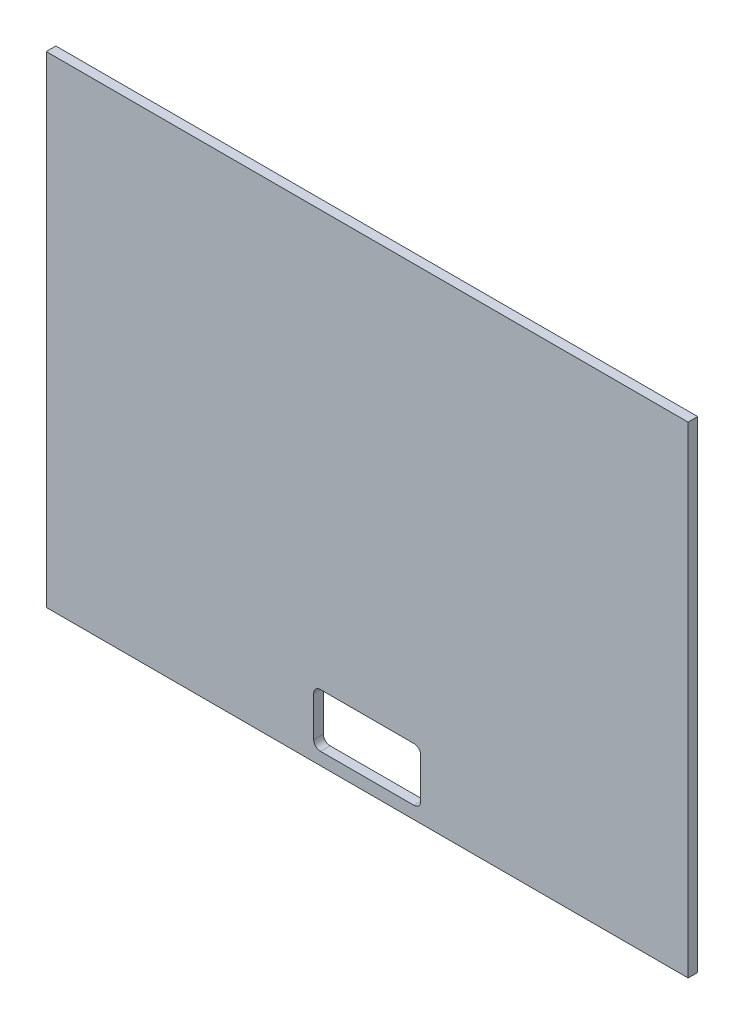
ISO-10303-21;
HEADER;
FILE_DESCRIPTION(('STEP AP214'),'2;1');
FILE_NAME('part.step','',(''),(''),'','','');
FILE_SCHEMA(('AUTOMOTIVE_DESIGN { 1 0 10303 214 1 1 1 1 }'));
ENDSEC;
DATA;
#1=APPLICATION_CONTEXT('core data for automotive mechanical design processes');
#2=APPLICATION_PROTOCOL_DEFINITION('international standard','automotive_design',2000,#1);
#3=PRODUCT_CONTEXT('',#1,'mechanical');
#4=PRODUCT('Part','Part','',(#3));
#5=PRODUCT_RELATED_PRODUCT_CATEGORY('part','',(#4));
#6=PRODUCT_DEFINITION_FORMATION('','',#4);
#7=PRODUCT_DEFINITION_CONTEXT('part definition',#1,'design');
#8=PRODUCT_DEFINITION('design','',#6,#7);
#9=PRODUCT_DEFINITION_SHAPE('','',#8);
#10=(LENGTH_UNIT() NAMED_UNIT(*) SI_UNIT(.MILLI.,.METRE.));
#11=(NAMED_UNIT(*) PLANE_ANGLE_UNIT() SI_UNIT($,.RADIAN.));
#12=(NAMED_UNIT(*) SI_UNIT($,.STERADIAN.) SOLID_ANGLE_UNIT());
#13=UNCERTAINTY_MEASURE_WITH_UNIT(LENGTH_MEASURE(1.E-05),#10,'distance_accuracy_value','');
#14=(GEOMETRIC_REPRESENTATION_CONTEXT(3) GLOBAL_UNCERTAINTY_ASSIGNED_CONTEXT((#13)) GLOBAL_UNIT_ASSIGNED_CONTEXT((#10,
#11,#12)) REPRESENTATION_CONTEXT('',''));
#15=CARTESIAN_POINT('',(0.,0.,0.));
#16=DIRECTION('',(0.,0.,1.));
#17=DIRECTION('',(1.,0.,0.));
#18=AXIS2_PLACEMENT_3D('',#15,#16,#17);
#19=CARTESIAN_POINT('',(812.8,-457.2,18.25625));
#20=DIRECTION('',(-1.,0.,0.));
#21=DIRECTION('',(0.,0.,1.));
#22=AXIS2_PLACEMENT_3D('',#19,#20,#21);
#23=PLANE('',#22);
#24=DIRECTION('',(0.,1.,0.));
#25=VECTOR('',#24,1.);
#26=CARTESIAN_POINT('',(812.8,-457.2,0.));
#27=LINE('',#26,#25);
#28=CARTESIAN_POINT('',(812.8,-457.2,0.));
#29=VERTEX_POINT('',#28);
#30=CARTESIAN_POINT('',(812.8,457.2,0.));
#31=VERTEX_POINT('',#30);
#32=EDGE_CURVE('E161',#29,#31,#27,.T.);
#33=ORIENTED_EDGE('',*,*,#32,.T.);
#34=DIRECTION('',(0.,0.,-1.));
#35=VECTOR('',#34,1.);
#36=CARTESIAN_POINT('',(812.8,457.2,18.25625));
#37=LINE('',#36,#35);
#38=CARTESIAN_POINT('',(812.8,457.2,18.25625));
#39=VERTEX_POINT('',#38);
#40=EDGE_CURVE('E140',#39,#31,#37,.T.);
#41=ORIENTED_EDGE('',*,*,#40,.F.);
#42=DIRECTION('',(0.,1.,0.));
#43=VECTOR('',#42,1.);
#44=CARTESIAN_POINT('',(812.8,-457.2,18.25625));
#45=LINE('',#44,#43);
#46=CARTESIAN_POINT('',(812.8,-457.2,18.25625));
#47=VERTEX_POINT('',#46);
#48=EDGE_CURVE('E148',#47,#39,#45,.T.);
#49=ORIENTED_EDGE('',*,*,#48,.F.);
#50=DIRECTION('',(0.,0.,-1.));
#51=VECTOR('',#50,1.);
#52=CARTESIAN_POINT('',(812.8,-457.2,18.25625));
#53=LINE('',#52,#51);
#54=EDGE_CURVE('E264',#47,#29,#53,.T.);
#55=ORIENTED_EDGE('',*,*,#54,.T.);
#56=EDGE_LOOP('',(#33,#41,#49,#55));
#57=FACE_BOUND('',#56,.T.);
#58=ADVANCED_FACE('F46',(#57),#23,.F.);
#59=CARTESIAN_POINT('',(-406.4,457.2,18.25625));
#60=DIRECTION('',(0.,-1.,0.));
#61=DIRECTION('',(0.,0.,-1.));
#62=AXIS2_PLACEMENT_3D('',#59,#60,#61);
#63=PLANE('',#62);
#64=DIRECTION('',(-1.,0.,0.));
#65=VECTOR('',#64,1.);
#66=CARTESIAN_POINT('',(-406.4,457.2,0.));
#67=LINE('',#66,#65);
#68=CARTESIAN_POINT('',(-406.4,457.2,0.));
#69=VERTEX_POINT('',#68);
#70=EDGE_CURVE('E245',#31,#69,#67,.T.);
#71=ORIENTED_EDGE('',*,*,#70,.T.);
#72=DIRECTION('',(0.,0.,-1.));
#73=VECTOR('',#72,1.);
#74=CARTESIAN_POINT('',(-406.4,457.2,18.25625));
#75=LINE('',#74,#73);
#76=CARTESIAN_POINT('',(-406.4,457.2,18.25625));
#77=VERTEX_POINT('',#76);
#78=EDGE_CURVE('E143',#77,#69,#75,.T.);
#79=ORIENTED_EDGE('',*,*,#78,.F.);
#80=DIRECTION('',(-1.,0.,0.));
#81=VECTOR('',#80,1.);
#82=CARTESIAN_POINT('',(-406.4,457.2,18.25625));
#83=LINE('',#82,#81);
#84=EDGE_CURVE('E136',#39,#77,#83,.T.);
#85=ORIENTED_EDGE('',*,*,#84,.F.);
#86=ORIENTED_EDGE('',*,*,#40,.T.);
#87=EDGE_LOOP('',(#71,#79,#85,#86));
#88=FACE_BOUND('',#87,.T.);
#89=ADVANCED_FACE('F138',(#88),#63,.F.);
#90=CARTESIAN_POINT('',(-406.4,-457.2,18.25625));
#91=DIRECTION('',(1.,0.,0.));
#92=DIRECTION('',(0.,0.,-1.));
#93=AXIS2_PLACEMENT_3D('',#90,#91,#92);
#94=PLANE('',#93);
#95=DIRECTION('',(0.,-1.,0.));
#96=VECTOR('',#95,1.);
#97=CARTESIAN_POINT('',(-406.4,-457.2,0.));
#98=LINE('',#97,#96);
#99=CARTESIAN_POINT('',(-406.4,-457.2,0.));
#100=VERTEX_POINT('',#99);
#101=EDGE_CURVE('E268',#69,#100,#98,.T.);
#102=ORIENTED_EDGE('',*,*,#101,.T.);
#103=DIRECTION('',(0.,0.,-1.));
#104=VECTOR('',#103,1.);
#105=CARTESIAN_POINT('',(-406.4,-457.2,18.25625));
#106=LINE('',#105,#104);
#107=CARTESIAN_POINT('',(-406.4,-457.2,18.25625));
#108=VERTEX_POINT('',#107);
#109=EDGE_CURVE('E171',#108,#100,#106,.T.);
#110=ORIENTED_EDGE('',*,*,#109,.F.);
#111=DIRECTION('',(0.,-1.,0.));
#112=VECTOR('',#111,1.);
#113=CARTESIAN_POINT('',(-406.4,-457.2,18.25625));
#114=LINE('',#113,#112);
#115=EDGE_CURVE('E147',#77,#108,#114,.T.);
#116=ORIENTED_EDGE('',*,*,#115,.F.);
#117=ORIENTED_EDGE('',*,*,#78,.T.);
#118=EDGE_LOOP('',(#102,#110,#116,#117));
#119=FACE_BOUND('',#118,.T.);
#120=ADVANCED_FACE('F286',(#119),#94,.F.);
#121=CARTESIAN_POINT('',(-406.4,-457.2,18.25625));
#122=DIRECTION('',(0.,1.,0.));
#123=DIRECTION('',(0.,0.,1.));
#124=AXIS2_PLACEMENT_3D('',#121,#122,#123);
#125=PLANE('',#124);
#126=DIRECTION('',(1.,0.,0.));
#127=VECTOR('',#126,1.);
#128=CARTESIAN_POINT('',(-406.4,-457.2,0.));
#129=LINE('',#128,#127);
#130=EDGE_CURVE('E158',#100,#29,#129,.T.);
#131=ORIENTED_EDGE('',*,*,#130,.T.);
#132=ORIENTED_EDGE('',*,*,#54,.F.);
#133=DIRECTION('',(1.,0.,0.));
#134=VECTOR('',#133,1.);
#135=CARTESIAN_POINT('',(-406.4,-457.2,18.25625));
#136=LINE('',#135,#134);
#137=EDGE_CURVE('E153',#108,#47,#136,.T.);
#138=ORIENTED_EDGE('',*,*,#137,.F.);
#139=ORIENTED_EDGE('',*,*,#109,.T.);
#140=EDGE_LOOP('',(#131,#132,#138,#139));
#141=FACE_BOUND('',#140,.T.);
#142=ADVANCED_FACE('F281',(#141),#125,.F.);
#143=CARTESIAN_POINT('',(0.,0.,18.25625));
#144=DIRECTION('',(0.,0.,-1.));
#145=DIRECTION('',(-1.,0.,0.));
#146=AXIS2_PLACEMENT_3D('',#143,#144,#145);
#147=PLANE('',#146);
#148=DIRECTION('',(1.,0.,0.));
#149=VECTOR('',#148,1.);
#150=CARTESIAN_POINT('',(304.8,-433.499600817332,18.25625));
#151=LINE('',#150,#149);
#152=CARTESIAN_POINT('',(114.3,-433.499600817332,18.25625));
#153=VERTEX_POINT('',#152);
#154=CARTESIAN_POINT('',(292.1,-433.499600817332,18.25625));
#155=VERTEX_POINT('',#154);
#156=EDGE_CURVE('E233',#153,#155,#151,.T.);
#157=ORIENTED_EDGE('',*,*,#156,.F.);
#158=CARTESIAN_POINT('',(114.3,-420.799600817332,18.25625));
#159=DIRECTION('',(0.,0.,-1.));
#160=DIRECTION('',(-1.,0.,0.));
#161=AXIS2_PLACEMENT_3D('',#158,#159,#160);
#162=CIRCLE('',#161,12.7);
#163=CARTESIAN_POINT('',(101.6,-420.799600817332,18.25625));
#164=VERTEX_POINT('',#163);
#165=EDGE_CURVE('E204',#153,#164,#162,.T.);
#166=ORIENTED_EDGE('',*,*,#165,.T.);
#167=DIRECTION('',(0.,-1.,0.));
#168=VECTOR('',#167,1.);
#169=CARTESIAN_POINT('',(101.6,-433.499600817332,18.25625));
#170=LINE('',#169,#168);
#171=CARTESIAN_POINT('',(101.6,-344.599600817332,18.25625));
#172=VERTEX_POINT('',#171);
#173=EDGE_CURVE('E251',#172,#164,#170,.T.);
#174=ORIENTED_EDGE('',*,*,#173,.F.);
#175=CARTESIAN_POINT('',(114.3,-344.599600817332,18.25625));
#176=DIRECTION('',(0.,0.,-1.));
#177=DIRECTION('',(-1.,0.,0.));
#178=AXIS2_PLACEMENT_3D('',#175,#176,#177);
#179=CIRCLE('',#178,12.7);
#180=CARTESIAN_POINT('',(114.3,-331.899600817332,18.25625));
#181=VERTEX_POINT('',#180);
#182=EDGE_CURVE('E210',#172,#181,#179,.T.);
#183=ORIENTED_EDGE('',*,*,#182,.T.);
#184=DIRECTION('',(-1.,0.,0.));
#185=VECTOR('',#184,1.);
#186=CARTESIAN_POINT('',(304.8,-331.899600817332,18.25625));
#187=LINE('',#186,#185);
#188=CARTESIAN_POINT('',(292.1,-331.899600817332,18.25625));
#189=VERTEX_POINT('',#188);
#190=EDGE_CURVE('E224',#189,#181,#187,.T.);
#191=ORIENTED_EDGE('',*,*,#190,.F.);
#192=CARTESIAN_POINT('',(292.1,-344.599600817332,18.25625));
#193=DIRECTION('',(0.,0.,-1.));
#194=DIRECTION('',(-1.,0.,0.));
#195=AXIS2_PLACEMENT_3D('',#192,#193,#194);
#196=CIRCLE('',#195,12.7);
#197=CARTESIAN_POINT('',(304.8,-344.599600817332,18.25625));
#198=VERTEX_POINT('',#197);
#199=EDGE_CURVE('E55',#189,#198,#196,.T.);
#200=ORIENTED_EDGE('',*,*,#199,.T.);
#201=DIRECTION('',(0.,1.,0.));
#202=VECTOR('',#201,1.);
#203=CARTESIAN_POINT('',(304.8,-433.499600817332,18.25625));
#204=LINE('',#203,#202);
#205=CARTESIAN_POINT('',(304.8,-420.799600817332,18.25625));
#206=VERTEX_POINT('',#205);
#207=EDGE_CURVE('E223',#206,#198,#204,.T.);
#208=ORIENTED_EDGE('',*,*,#207,.F.);
#209=CARTESIAN_POINT('',(292.1,-420.799600817332,18.25625));
#210=DIRECTION('',(0.,0.,-1.));
#211=DIRECTION('',(-1.,0.,0.));
#212=AXIS2_PLACEMENT_3D('',#209,#210,#211);
#213=CIRCLE('',#212,12.7);
#214=EDGE_CURVE('E198',#206,#155,#213,.T.);
#215=ORIENTED_EDGE('',*,*,#214,.T.);
#216=EDGE_LOOP('',(#157,#166,#174,#183,#191,#200,#208,#215));
#217=FACE_BOUND('',#216,.T.);
#218=ORIENTED_EDGE('',*,*,#48,.T.);
#219=ORIENTED_EDGE('',*,*,#84,.T.);
#220=ORIENTED_EDGE('',*,*,#115,.T.);
#221=ORIENTED_EDGE('',*,*,#137,.T.);
#222=EDGE_LOOP('',(#218,#219,#220,#221));
#223=FACE_BOUND('',#222,.T.);
#224=ADVANCED_FACE('F151',(#217,#223),#147,.F.);
#225=CARTESIAN_POINT('',(0.,0.,0.));
#226=DIRECTION('',(0.,0.,-1.));
#227=DIRECTION('',(-1.,0.,0.));
#228=AXIS2_PLACEMENT_3D('',#225,#226,#227);
#229=PLANE('',#228);
#230=DIRECTION('',(-1.,0.,0.));
#231=VECTOR('',#230,1.);
#232=CARTESIAN_POINT('',(304.8,-331.899600817332,0.));
#233=LINE('',#232,#231);
#234=CARTESIAN_POINT('',(292.1,-331.899600817332,0.));
#235=VERTEX_POINT('',#234);
#236=CARTESIAN_POINT('',(114.3,-331.899600817332,0.));
#237=VERTEX_POINT('',#236);
#238=EDGE_CURVE('E236',#235,#237,#233,.T.);
#239=ORIENTED_EDGE('',*,*,#238,.T.);
#240=CARTESIAN_POINT('',(114.3,-344.599600817332,0.));
#241=DIRECTION('',(0.,0.,-1.));
#242=DIRECTION('',(-1.,0.,0.));
#243=AXIS2_PLACEMENT_3D('',#240,#241,#242);
#244=CIRCLE('',#243,12.7);
#245=CARTESIAN_POINT('',(101.6,-344.599600817332,0.));
#246=VERTEX_POINT('',#245);
#247=EDGE_CURVE('E213',#237,#246,#244,.F.);
#248=ORIENTED_EDGE('',*,*,#247,.T.);
#249=DIRECTION('',(0.,-1.,0.));
#250=VECTOR('',#249,1.);
#251=CARTESIAN_POINT('',(101.6,-433.499600817332,0.));
#252=LINE('',#251,#250);
#253=CARTESIAN_POINT('',(101.6,-420.799600817332,0.));
#254=VERTEX_POINT('',#253);
#255=EDGE_CURVE('E259',#246,#254,#252,.T.);
#256=ORIENTED_EDGE('',*,*,#255,.T.);
#257=CARTESIAN_POINT('',(114.3,-420.799600817332,0.));
#258=DIRECTION('',(0.,0.,-1.));
#259=DIRECTION('',(-1.,0.,0.));
#260=AXIS2_PLACEMENT_3D('',#257,#258,#259);
#261=CIRCLE('',#260,12.7);
#262=CARTESIAN_POINT('',(114.3,-433.499600817332,0.));
#263=VERTEX_POINT('',#262);
#264=EDGE_CURVE('E207',#254,#263,#261,.F.);
#265=ORIENTED_EDGE('',*,*,#264,.T.);
#266=DIRECTION('',(1.,0.,0.));
#267=VECTOR('',#266,1.);
#268=CARTESIAN_POINT('',(304.8,-433.499600817332,0.));
#269=LINE('',#268,#267);
#270=CARTESIAN_POINT('',(292.1,-433.499600817332,0.));
#271=VERTEX_POINT('',#270);
#272=EDGE_CURVE('E247',#263,#271,#269,.T.);
#273=ORIENTED_EDGE('',*,*,#272,.T.);
#274=CARTESIAN_POINT('',(292.1,-420.799600817332,0.));
#275=DIRECTION('',(0.,0.,-1.));
#276=DIRECTION('',(-1.,0.,0.));
#277=AXIS2_PLACEMENT_3D('',#274,#275,#276);
#278=CIRCLE('',#277,12.7);
#279=CARTESIAN_POINT('',(304.8,-420.799600817332,0.));
#280=VERTEX_POINT('',#279);
#281=EDGE_CURVE('E201',#271,#280,#278,.F.);
#282=ORIENTED_EDGE('',*,*,#281,.T.);
#283=DIRECTION('',(0.,1.,0.));
#284=VECTOR('',#283,1.);
#285=CARTESIAN_POINT('',(304.8,-433.499600817332,0.));
#286=LINE('',#285,#284);
#287=CARTESIAN_POINT('',(304.8,-344.599600817332,0.));
#288=VERTEX_POINT('',#287);
#289=EDGE_CURVE('E239',#280,#288,#286,.T.);
#290=ORIENTED_EDGE('',*,*,#289,.T.);
#291=CARTESIAN_POINT('',(292.1,-344.599600817332,0.));
#292=DIRECTION('',(0.,0.,-1.));
#293=DIRECTION('',(-1.,0.,0.));
#294=AXIS2_PLACEMENT_3D('',#291,#292,#293);
#295=CIRCLE('',#294,12.7);
#296=EDGE_CURVE('E11',#288,#235,#295,.F.);
#297=ORIENTED_EDGE('',*,*,#296,.T.);
#298=EDGE_LOOP('',(#239,#248,#256,#265,#273,#282,#290,#297));
#299=FACE_BOUND('',#298,.T.);
#300=ORIENTED_EDGE('',*,*,#32,.F.);
#301=ORIENTED_EDGE('',*,*,#130,.F.);
#302=ORIENTED_EDGE('',*,*,#101,.F.);
#303=ORIENTED_EDGE('',*,*,#70,.F.);
#304=EDGE_LOOP('',(#300,#301,#302,#303));
#305=FACE_BOUND('',#304,.T.);
#306=ADVANCED_FACE('F285',(#299,#305),#229,.T.);
#307=CARTESIAN_POINT('',(101.6,-433.499600817332,0.));
#308=DIRECTION('',(-1.,0.,0.));
#309=DIRECTION('',(0.,0.,1.));
#310=AXIS2_PLACEMENT_3D('',#307,#308,#309);
#311=PLANE('',#310);
#312=ORIENTED_EDGE('',*,*,#173,.T.);
#313=DIRECTION('',(0.,0.,1.));
#314=VECTOR('',#313,1.);
#315=CARTESIAN_POINT('',(101.6,-420.799600817332,0.));
#316=LINE('',#315,#314);
#317=EDGE_CURVE('E189',#164,#254,#316,.F.);
#318=ORIENTED_EDGE('',*,*,#317,.T.);
#319=ORIENTED_EDGE('',*,*,#255,.F.);
#320=DIRECTION('',(0.,0.,1.));
#321=VECTOR('',#320,1.);
#322=CARTESIAN_POINT('',(101.6,-344.599600817332,18.25625));
#323=LINE('',#322,#321);
#324=EDGE_CURVE('E185',#246,#172,#323,.T.);
#325=ORIENTED_EDGE('',*,*,#324,.T.);
#326=EDGE_LOOP('',(#312,#318,#319,#325));
#327=FACE_BOUND('',#326,.T.);
#328=ADVANCED_FACE('F319',(#327),#311,.F.);
#329=CARTESIAN_POINT('',(304.8,-331.899600817332,0.));
#330=DIRECTION('',(0.,1.,0.));
#331=DIRECTION('',(0.,0.,1.));
#332=AXIS2_PLACEMENT_3D('',#329,#330,#331);
#333=PLANE('',#332);
#334=ORIENTED_EDGE('',*,*,#190,.T.);
#335=DIRECTION('',(0.,0.,1.));
#336=VECTOR('',#335,1.);
#337=CARTESIAN_POINT('',(114.3,-331.899600817332,0.));
#338=LINE('',#337,#336);
#339=EDGE_CURVE('E62',#181,#237,#338,.F.);
#340=ORIENTED_EDGE('',*,*,#339,.T.);
#341=ORIENTED_EDGE('',*,*,#238,.F.);
#342=DIRECTION('',(0.,0.,1.));
#343=VECTOR('',#342,1.);
#344=CARTESIAN_POINT('',(292.1,-331.899600817332,18.25625));
#345=LINE('',#344,#343);
#346=EDGE_CURVE('E192',#235,#189,#345,.T.);
#347=ORIENTED_EDGE('',*,*,#346,.T.);
#348=EDGE_LOOP('',(#334,#340,#341,#347));
#349=FACE_BOUND('',#348,.T.);
#350=ADVANCED_FACE('F235',(#349),#333,.F.);
#351=CARTESIAN_POINT('',(304.8,-433.499600817332,0.));
#352=DIRECTION('',(1.,0.,0.));
#353=DIRECTION('',(0.,0.,-1.));
#354=AXIS2_PLACEMENT_3D('',#351,#352,#353);
#355=PLANE('',#354);
#356=ORIENTED_EDGE('',*,*,#289,.F.);
#357=DIRECTION('',(0.,0.,1.));
#358=VECTOR('',#357,1.);
#359=CARTESIAN_POINT('',(304.8,-420.799600817332,18.25625));
#360=LINE('',#359,#358);
#361=EDGE_CURVE('E169',#280,#206,#360,.T.);
#362=ORIENTED_EDGE('',*,*,#361,.T.);
#363=ORIENTED_EDGE('',*,*,#207,.T.);
#364=DIRECTION('',(0.,0.,1.));
#365=VECTOR('',#364,1.);
#366=CARTESIAN_POINT('',(304.8,-344.599600817332,0.));
#367=LINE('',#366,#365);
#368=EDGE_CURVE('E163',#198,#288,#367,.F.);
#369=ORIENTED_EDGE('',*,*,#368,.T.);
#370=EDGE_LOOP('',(#356,#362,#363,#369));
#371=FACE_BOUND('',#370,.T.);
#372=ADVANCED_FACE('F230',(#371),#355,.F.);
#373=CARTESIAN_POINT('',(304.8,-433.499600817332,0.));
#374=DIRECTION('',(0.,-1.,0.));
#375=DIRECTION('',(1.,0.,0.));
#376=AXIS2_PLACEMENT_3D('',#373,#374,#375);
#377=PLANE('',#376);
#378=ORIENTED_EDGE('',*,*,#156,.T.);
#379=DIRECTION('',(0.,0.,1.));
#380=VECTOR('',#379,1.);
#381=CARTESIAN_POINT('',(292.1,-433.499600817332,0.));
#382=LINE('',#381,#380);
#383=EDGE_CURVE('E182',#155,#271,#382,.F.);
#384=ORIENTED_EDGE('',*,*,#383,.T.);
#385=ORIENTED_EDGE('',*,*,#272,.F.);
#386=DIRECTION('',(0.,0.,1.));
#387=VECTOR('',#386,1.);
#388=CARTESIAN_POINT('',(114.3,-433.499600817332,18.25625));
#389=LINE('',#388,#387);
#390=EDGE_CURVE('E178',#263,#153,#389,.T.);
#391=ORIENTED_EDGE('',*,*,#390,.T.);
#392=EDGE_LOOP('',(#378,#384,#385,#391));
#393=FACE_BOUND('',#392,.T.);
#394=ADVANCED_FACE('F304',(#393),#377,.F.);
#395=CARTESIAN_POINT('',(292.1,-420.799600817332,0.));
#396=DIRECTION('',(0.,0.,-1.));
#397=DIRECTION('',(-1.,0.,0.));
#398=AXIS2_PLACEMENT_3D('',#395,#396,#397);
#399=CYLINDRICAL_SURFACE('',#398,12.7);
#400=ORIENTED_EDGE('',*,*,#281,.F.);
#401=ORIENTED_EDGE('',*,*,#383,.F.);
#402=ORIENTED_EDGE('',*,*,#214,.F.);
#403=ORIENTED_EDGE('',*,*,#361,.F.);
#404=EDGE_LOOP('',(#400,#401,#402,#403));
#405=FACE_BOUND('',#404,.T.);
#406=ADVANCED_FACE('F300',(#405),#399,.F.);
#407=CARTESIAN_POINT('',(114.3,-420.799600817332,0.));
#408=DIRECTION('',(0.,0.,-1.));
#409=DIRECTION('',(-1.,0.,0.));
#410=AXIS2_PLACEMENT_3D('',#407,#408,#409);
#411=CYLINDRICAL_SURFACE('',#410,12.7);
#412=ORIENTED_EDGE('',*,*,#264,.F.);
#413=ORIENTED_EDGE('',*,*,#317,.F.);
#414=ORIENTED_EDGE('',*,*,#165,.F.);
#415=ORIENTED_EDGE('',*,*,#390,.F.);
#416=EDGE_LOOP('',(#412,#413,#414,#415));
#417=FACE_BOUND('',#416,.T.);
#418=ADVANCED_FACE('F303',(#417),#411,.F.);
#419=CARTESIAN_POINT('',(114.3,-344.599600817332,0.));
#420=DIRECTION('',(0.,0.,-1.));
#421=DIRECTION('',(-1.,0.,0.));
#422=AXIS2_PLACEMENT_3D('',#419,#420,#421);
#423=CYLINDRICAL_SURFACE('',#422,12.7);
#424=ORIENTED_EDGE('',*,*,#247,.F.);
#425=ORIENTED_EDGE('',*,*,#339,.F.);
#426=ORIENTED_EDGE('',*,*,#182,.F.);
#427=ORIENTED_EDGE('',*,*,#324,.F.);
#428=EDGE_LOOP('',(#424,#425,#426,#427));
#429=FACE_BOUND('',#428,.T.);
#430=ADVANCED_FACE('F307',(#429),#423,.F.);
#431=CARTESIAN_POINT('',(292.1,-344.599600817332,0.));
#432=DIRECTION('',(0.,0.,-1.));
#433=DIRECTION('',(-1.,0.,0.));
#434=AXIS2_PLACEMENT_3D('',#431,#432,#433);
#435=CYLINDRICAL_SURFACE('',#434,12.7);
#436=ORIENTED_EDGE('',*,*,#296,.F.);
#437=ORIENTED_EDGE('',*,*,#368,.F.);
#438=ORIENTED_EDGE('',*,*,#199,.F.);
#439=ORIENTED_EDGE('',*,*,#346,.F.);
#440=EDGE_LOOP('',(#436,#437,#438,#439));
#441=FACE_BOUND('',#440,.T.);
#442=ADVANCED_FACE('F48',(#441),#435,.F.);
#443=CLOSED_SHELL('',(#58,#89,#120,#142,#224,#306,#328,#350,#372,#394,#406,#418,#430,#442));
#444=MANIFOLD_SOLID_BREP('B2',#443);
#445=ADVANCED_BREP_SHAPE_REPRESENTATION('',(#18,#444),#14);
#446=SHAPE_DEFINITION_REPRESENTATION(#9,#445);
ENDSEC;
END-ISO-10303-21;
